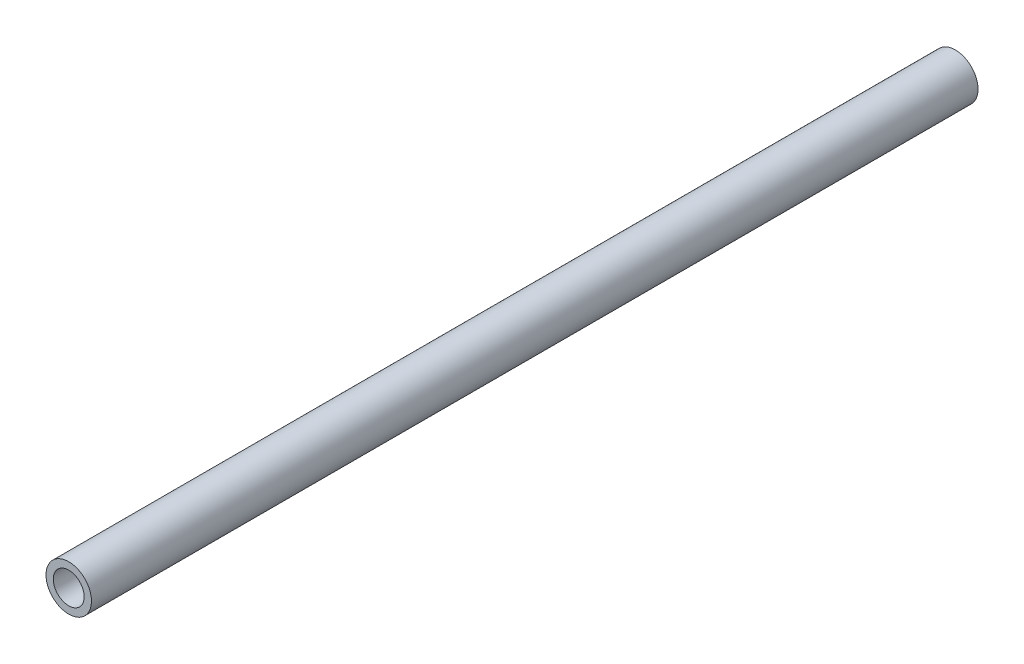
ISO-10303-21;
HEADER;
FILE_DESCRIPTION(('STEP AP214'),'2;1');
FILE_NAME('part.step','',(''),(''),'','','');
FILE_SCHEMA(('AUTOMOTIVE_DESIGN { 1 0 10303 214 1 1 1 1 }'));
ENDSEC;
DATA;
#1=APPLICATION_CONTEXT('core data for automotive mechanical design processes');
#2=APPLICATION_PROTOCOL_DEFINITION('international standard','automotive_design',2000,#1);
#3=PRODUCT_CONTEXT('',#1,'mechanical');
#4=PRODUCT('Part','Part','',(#3));
#5=PRODUCT_RELATED_PRODUCT_CATEGORY('part','',(#4));
#6=PRODUCT_DEFINITION_FORMATION('','',#4);
#7=PRODUCT_DEFINITION_CONTEXT('part definition',#1,'design');
#8=PRODUCT_DEFINITION('design','',#6,#7);
#9=PRODUCT_DEFINITION_SHAPE('','',#8);
#10=(LENGTH_UNIT() NAMED_UNIT(*) SI_UNIT(.MILLI.,.METRE.));
#11=(NAMED_UNIT(*) PLANE_ANGLE_UNIT() SI_UNIT($,.RADIAN.));
#12=(NAMED_UNIT(*) SI_UNIT($,.STERADIAN.) SOLID_ANGLE_UNIT());
#13=UNCERTAINTY_MEASURE_WITH_UNIT(LENGTH_MEASURE(1.E-05),#10,'distance_accuracy_value','');
#14=(GEOMETRIC_REPRESENTATION_CONTEXT(3) GLOBAL_UNCERTAINTY_ASSIGNED_CONTEXT((#13)) GLOBAL_UNIT_ASSIGNED_CONTEXT((#10,
#11,#12)) REPRESENTATION_CONTEXT('',''));
#15=CARTESIAN_POINT('',(0.,0.,0.));
#16=DIRECTION('',(0.,0.,1.));
#17=DIRECTION('',(1.,0.,0.));
#18=AXIS2_PLACEMENT_3D('',#15,#16,#17);
#19=CARTESIAN_POINT('',(0.,0.,123.825));
#20=DIRECTION('',(0.,0.,-1.));
#21=DIRECTION('',(-1.,0.,0.));
#22=AXIS2_PLACEMENT_3D('',#19,#20,#21);
#23=CYLINDRICAL_SURFACE('',#22,6.35);
#24=CARTESIAN_POINT('',(0.,0.,123.825));
#25=DIRECTION('',(0.,0.,-1.));
#26=DIRECTION('',(-1.,0.,0.));
#27=AXIS2_PLACEMENT_3D('',#24,#25,#26);
#28=CIRCLE('',#27,6.35);
#29=CARTESIAN_POINT('',(-6.35,0.,123.825));
#30=VERTEX_POINT('',#29);
#31=EDGE_CURVE('E18',#30,#30,#28,.F.);
#32=ORIENTED_EDGE('',*,*,#31,.F.);
#33=EDGE_LOOP('',(#32));
#34=FACE_BOUND('',#33,.T.);
#35=CARTESIAN_POINT('',(0.,0.,-123.825));
#36=DIRECTION('',(0.,0.,-1.));
#37=DIRECTION('',(-1.,0.,0.));
#38=AXIS2_PLACEMENT_3D('',#35,#36,#37);
#39=CIRCLE('',#38,6.35);
#40=CARTESIAN_POINT('',(-6.35,0.,-123.825));
#41=VERTEX_POINT('',#40);
#42=EDGE_CURVE('E27',#41,#41,#39,.F.);
#43=ORIENTED_EDGE('',*,*,#42,.T.);
#44=EDGE_LOOP('',(#43));
#45=FACE_BOUND('',#44,.T.);
#46=ADVANCED_FACE('F14',(#34,#45),#23,.T.);
#47=CARTESIAN_POINT('',(-6.4262,-6.4262,123.825));
#48=DIRECTION('',(0.,0.,1.));
#49=DIRECTION('',(1.,0.,0.));
#50=AXIS2_PLACEMENT_3D('',#47,#48,#49);
#51=PLANE('',#50);
#52=CARTESIAN_POINT('',(0.,0.,123.825));
#53=DIRECTION('',(0.,0.,-1.));
#54=DIRECTION('',(-1.,0.,0.));
#55=AXIS2_PLACEMENT_3D('',#52,#53,#54);
#56=CIRCLE('',#55,4.318);
#57=CARTESIAN_POINT('',(-4.318,0.,123.825));
#58=VERTEX_POINT('',#57);
#59=EDGE_CURVE('E22',#58,#58,#56,.F.);
#60=ORIENTED_EDGE('',*,*,#59,.F.);
#61=EDGE_LOOP('',(#60));
#62=FACE_BOUND('',#61,.T.);
#63=ORIENTED_EDGE('',*,*,#31,.T.);
#64=EDGE_LOOP('',(#63));
#65=FACE_BOUND('',#64,.T.);
#66=ADVANCED_FACE('F35',(#62,#65),#51,.T.);
#67=CARTESIAN_POINT('',(-6.4262,-6.4262,-123.825));
#68=DIRECTION('',(0.,0.,1.));
#69=DIRECTION('',(1.,0.,0.));
#70=AXIS2_PLACEMENT_3D('',#67,#68,#69);
#71=PLANE('',#70);
#72=CARTESIAN_POINT('',(0.,0.,-123.825));
#73=DIRECTION('',(0.,0.,-1.));
#74=DIRECTION('',(-1.,0.,0.));
#75=AXIS2_PLACEMENT_3D('',#72,#73,#74);
#76=CIRCLE('',#75,4.318);
#77=CARTESIAN_POINT('',(-4.318,0.,-123.825));
#78=VERTEX_POINT('',#77);
#79=EDGE_CURVE('E10',#78,#78,#76,.T.);
#80=ORIENTED_EDGE('',*,*,#79,.F.);
#81=EDGE_LOOP('',(#80));
#82=FACE_BOUND('',#81,.T.);
#83=ORIENTED_EDGE('',*,*,#42,.F.);
#84=EDGE_LOOP('',(#83));
#85=FACE_BOUND('',#84,.T.);
#86=ADVANCED_FACE('F16',(#82,#85),#71,.F.);
#87=CARTESIAN_POINT('',(0.,0.,123.825));
#88=DIRECTION('',(0.,0.,-1.));
#89=DIRECTION('',(-1.,0.,0.));
#90=AXIS2_PLACEMENT_3D('',#87,#88,#89);
#91=CYLINDRICAL_SURFACE('',#90,4.318);
#92=ORIENTED_EDGE('',*,*,#79,.T.);
#93=EDGE_LOOP('',(#92));
#94=FACE_BOUND('',#93,.T.);
#95=ORIENTED_EDGE('',*,*,#59,.T.);
#96=EDGE_LOOP('',(#95));
#97=FACE_BOUND('',#96,.T.);
#98=ADVANCED_FACE('F45',(#94,#97),#91,.F.);
#99=CLOSED_SHELL('',(#46,#66,#86,#98));
#100=MANIFOLD_SOLID_BREP('B1',#99);
#101=ADVANCED_BREP_SHAPE_REPRESENTATION('',(#18,#100),#14);
#102=SHAPE_DEFINITION_REPRESENTATION(#9,#101);
ENDSEC;
END-ISO-10303-21;
